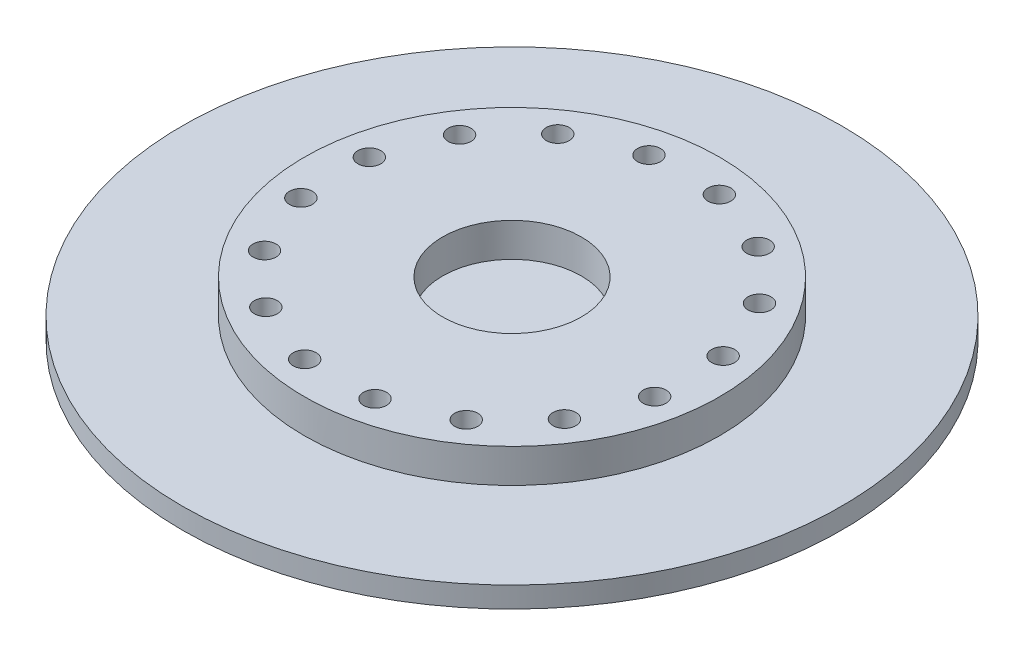
ISO-10303-21;
HEADER;
FILE_DESCRIPTION(('STEP AP214'),'2;1');
FILE_NAME('part.step','',(''),(''),'','','');
FILE_SCHEMA(('AUTOMOTIVE_DESIGN { 1 0 10303 214 1 1 1 1 }'));
ENDSEC;
DATA;
#1=APPLICATION_CONTEXT('core data for automotive mechanical design processes');
#2=APPLICATION_PROTOCOL_DEFINITION('international standard','automotive_design',2000,#1);
#3=PRODUCT_CONTEXT('',#1,'mechanical');
#4=PRODUCT('Part','Part','',(#3));
#5=PRODUCT_RELATED_PRODUCT_CATEGORY('part','',(#4));
#6=PRODUCT_DEFINITION_FORMATION('','',#4);
#7=PRODUCT_DEFINITION_CONTEXT('part definition',#1,'design');
#8=PRODUCT_DEFINITION('design','',#6,#7);
#9=PRODUCT_DEFINITION_SHAPE('','',#8);
#10=(LENGTH_UNIT() NAMED_UNIT(*) SI_UNIT(.MILLI.,.METRE.));
#11=(NAMED_UNIT(*) PLANE_ANGLE_UNIT() SI_UNIT($,.RADIAN.));
#12=(NAMED_UNIT(*) SI_UNIT($,.STERADIAN.) SOLID_ANGLE_UNIT());
#13=UNCERTAINTY_MEASURE_WITH_UNIT(LENGTH_MEASURE(1.E-05),#10,'distance_accuracy_value','');
#14=(GEOMETRIC_REPRESENTATION_CONTEXT(3) GLOBAL_UNCERTAINTY_ASSIGNED_CONTEXT((#13)) GLOBAL_UNIT_ASSIGNED_CONTEXT((#10,
#11,#12)) REPRESENTATION_CONTEXT('',''));
#15=CARTESIAN_POINT('',(0.,0.,0.));
#16=DIRECTION('',(0.,0.,1.));
#17=DIRECTION('',(1.,0.,0.));
#18=AXIS2_PLACEMENT_3D('',#15,#16,#17);
#19=CARTESIAN_POINT('',(0.,7.62,0.));
#20=DIRECTION('',(0.,-1.,0.));
#21=DIRECTION('',(0.,0.,-1.));
#22=AXIS2_PLACEMENT_3D('',#19,#20,#21);
#23=CYLINDRICAL_SURFACE('',#22,120.65);
#24=CARTESIAN_POINT('',(0.,7.62,0.));
#25=DIRECTION('',(0.,1.,0.));
#26=DIRECTION('',(0.,0.,1.));
#27=AXIS2_PLACEMENT_3D('',#24,#25,#26);
#28=CIRCLE('',#27,120.65);
#29=CARTESIAN_POINT('',(0.,7.62,-120.65));
#30=VERTEX_POINT('',#29);
#31=EDGE_CURVE('E39',#30,#30,#28,.T.);
#32=CARTESIAN_POINT('',(0.,0.,0.));
#33=DIRECTION('',(0.,1.,0.));
#34=DIRECTION('',(0.,0.,1.));
#35=AXIS2_PLACEMENT_3D('',#32,#33,#34);
#36=CIRCLE('',#35,120.65);
#37=CARTESIAN_POINT('',(0.,0.,-120.65));
#38=VERTEX_POINT('',#37);
#39=EDGE_CURVE('E34',#38,#38,#36,.T.);
#40=CARTESIAN_POINT('',(0.,7.62,-120.65));
#41=CARTESIAN_POINT('',(0.,7.540625,-120.65));
#42=CARTESIAN_POINT('',(0.,7.46125,-120.65));
#43=CARTESIAN_POINT('',(0.,7.3025,-120.65));
#44=CARTESIAN_POINT('',(0.,7.223125,-120.65));
#45=CARTESIAN_POINT('',(0.,7.064375,-120.65));
#46=CARTESIAN_POINT('',(0.,6.985,-120.65));
#47=CARTESIAN_POINT('',(0.,6.82625,-120.65));
#48=CARTESIAN_POINT('',(0.,6.746875,-120.65));
#49=CARTESIAN_POINT('',(0.,6.588125,-120.65));
#50=CARTESIAN_POINT('',(0.,6.50875,-120.65));
#51=CARTESIAN_POINT('',(0.,6.35,-120.65));
#52=CARTESIAN_POINT('',(0.,6.270625,-120.65));
#53=CARTESIAN_POINT('',(0.,6.111875,-120.65));
#54=CARTESIAN_POINT('',(0.,6.0325,-120.65));
#55=CARTESIAN_POINT('',(0.,5.87375,-120.65));
#56=CARTESIAN_POINT('',(0.,5.794375,-120.65));
#57=CARTESIAN_POINT('',(0.,5.635625,-120.65));
#58=CARTESIAN_POINT('',(0.,5.55625,-120.65));
#59=CARTESIAN_POINT('',(0.,5.3975,-120.65));
#60=CARTESIAN_POINT('',(0.,5.318125,-120.65));
#61=CARTESIAN_POINT('',(0.,5.159375,-120.65));
#62=CARTESIAN_POINT('',(0.,5.08,-120.65));
#63=CARTESIAN_POINT('',(0.,4.92125,-120.65));
#64=CARTESIAN_POINT('',(0.,4.841875,-120.65));
#65=CARTESIAN_POINT('',(0.,4.683125,-120.65));
#66=CARTESIAN_POINT('',(0.,4.60375,-120.65));
#67=CARTESIAN_POINT('',(0.,4.445,-120.65));
#68=CARTESIAN_POINT('',(0.,4.365625,-120.65));
#69=CARTESIAN_POINT('',(0.,4.206875,-120.65));
#70=CARTESIAN_POINT('',(0.,4.1275,-120.65));
#71=CARTESIAN_POINT('',(0.,3.96875,-120.65));
#72=CARTESIAN_POINT('',(0.,3.889375,-120.65));
#73=CARTESIAN_POINT('',(0.,3.730625,-120.65));
#74=CARTESIAN_POINT('',(0.,3.65125,-120.65));
#75=CARTESIAN_POINT('',(0.,3.4925,-120.65));
#76=CARTESIAN_POINT('',(0.,3.413125,-120.65));
#77=CARTESIAN_POINT('',(0.,3.254375,-120.65));
#78=CARTESIAN_POINT('',(0.,3.175,-120.65));
#79=CARTESIAN_POINT('',(0.,3.01625,-120.65));
#80=CARTESIAN_POINT('',(0.,2.936875,-120.65));
#81=CARTESIAN_POINT('',(0.,2.778125,-120.65));
#82=CARTESIAN_POINT('',(0.,2.69875,-120.65));
#83=CARTESIAN_POINT('',(0.,2.54,-120.65));
#84=CARTESIAN_POINT('',(0.,2.460625,-120.65));
#85=CARTESIAN_POINT('',(0.,2.301875,-120.65));
#86=CARTESIAN_POINT('',(0.,2.2225,-120.65));
#87=CARTESIAN_POINT('',(0.,2.06375,-120.65));
#88=CARTESIAN_POINT('',(0.,1.984375,-120.65));
#89=CARTESIAN_POINT('',(0.,1.825625,-120.65));
#90=CARTESIAN_POINT('',(0.,1.74625,-120.65));
#91=CARTESIAN_POINT('',(0.,1.5875,-120.65));
#92=CARTESIAN_POINT('',(0.,1.508125,-120.65));
#93=CARTESIAN_POINT('',(0.,1.349375,-120.65));
#94=CARTESIAN_POINT('',(0.,1.27,-120.65));
#95=CARTESIAN_POINT('',(0.,1.11125,-120.65));
#96=CARTESIAN_POINT('',(0.,1.031875,-120.65));
#97=CARTESIAN_POINT('',(0.,0.873125,-120.65));
#98=CARTESIAN_POINT('',(0.,0.79375,-120.65));
#99=CARTESIAN_POINT('',(0.,0.635,-120.65));
#100=CARTESIAN_POINT('',(0.,0.555625,-120.65));
#101=CARTESIAN_POINT('',(0.,0.396875,-120.65));
#102=CARTESIAN_POINT('',(0.,0.3175,-120.65));
#103=CARTESIAN_POINT('',(0.,0.15875,-120.65));
#104=CARTESIAN_POINT('',(0.,0.0793749999999999,-120.65));
#105=CARTESIAN_POINT('',(0.,0.,-120.65));
#106=B_SPLINE_CURVE_WITH_KNOTS('',3,(#40,#41,#42,#43,#44,#45,#46,#47,#48,#49,#50,#51,#52,#53,
#54,#55,#56,#57,#58,#59,#60,#61,#62,#63,#64,#65,#66,#67,#68,#69,#70,#71,#72,#73,#74,#75,#76,#77,
#78,#79,#80,#81,#82,#83,#84,#85,#86,#87,#88,#89,#90,#91,#92,#93,#94,#95,#96,#97,#98,#99,#100,
#101,#102,#103,#104,#105),.UNSPECIFIED.,.F.,.F.,(4,2,2,2,2,2,2,2,2,2,2,2,2,2,2,2,2,2,2,2,2,2,2,
2,2,2,2,2,2,2,2,2,4),(0.,0.238125,0.47625,0.714375000000001,0.9525,1.190625,1.42875,1.666875,
1.905,2.143125,2.38125,2.619375,2.8575,3.095625,3.33375,3.571875,3.81,4.048125,4.28625,4.524375,
4.7625,5.000625,5.23875,5.476875,5.715,5.953125,6.19125,6.429375,6.6675,6.905625,7.14375,
7.381875,7.62),.UNSPECIFIED.);
#107=EDGE_CURVE('BSEAM31',#30,#38,#106,.T.);
#108=ORIENTED_EDGE('',*,*,#31,.F.);
#109=ORIENTED_EDGE('',*,*,#39,.T.);
#110=ORIENTED_EDGE('',*,*,#107,.T.);
#111=ORIENTED_EDGE('',*,*,#107,.F.);
#112=EDGE_LOOP('',(#108,#110,#109,#111));
#113=FACE_BOUND('',#112,.T.);
#114=ADVANCED_FACE('F31',(#113),#23,.T.);
#115=CARTESIAN_POINT('',(0.,7.62,0.));
#116=DIRECTION('',(0.,1.,0.));
#117=DIRECTION('',(0.,0.,1.));
#118=AXIS2_PLACEMENT_3D('',#115,#116,#117);
#119=PLANE('',#118);
#120=CARTESIAN_POINT('',(0.,7.62,0.));
#121=DIRECTION('',(0.,1.,0.));
#122=DIRECTION('',(0.,0.,1.));
#123=AXIS2_PLACEMENT_3D('',#120,#121,#122);
#124=CIRCLE('',#123,76.0000004);
#125=CARTESIAN_POINT('',(0.,7.62,76.0000004));
#126=VERTEX_POINT('',#125);
#127=EDGE_CURVE('E11',#126,#126,#124,.T.);
#128=ORIENTED_EDGE('',*,*,#127,.F.);
#129=EDGE_LOOP('',(#128));
#130=FACE_BOUND('',#129,.T.);
#131=ORIENTED_EDGE('',*,*,#31,.T.);
#132=EDGE_LOOP('',(#131));
#133=FACE_BOUND('',#132,.T.);
#134=ADVANCED_FACE('F130',(#130,#133),#119,.T.);
#135=CARTESIAN_POINT('',(0.,0.,0.));
#136=DIRECTION('',(0.,1.,0.));
#137=DIRECTION('',(0.,0.,1.));
#138=AXIS2_PLACEMENT_3D('',#135,#136,#137);
#139=PLANE('',#138);
#140=CARTESIAN_POINT('',(13.5729496041598,0.,63.7204640523195));
#141=DIRECTION('',(0.,-1.,0.));
#142=DIRECTION('',(-0.382683432365077,0.,-0.923879532511292));
#143=AXIS2_PLACEMENT_3D('',#140,#141,#142);
#144=CIRCLE('',#143,4.2);
#145=CARTESIAN_POINT('',(11.9656791882264,0.,59.8401700157721));
#146=VERTEX_POINT('',#145);
#147=EDGE_CURVE('E397',#146,#146,#144,.T.);
#148=ORIENTED_EDGE('',*,*,#147,.F.);
#149=EDGE_LOOP('',(#148));
#150=FACE_BOUND('',#149,.T.);
#151=CARTESIAN_POINT('',(36.9245362305284,0.,53.6758895982209));
#152=DIRECTION('',(0.,-1.,0.));
#153=DIRECTION('',(-0.707106781186539,0.,-0.707106781186556));
#154=AXIS2_PLACEMENT_3D('',#151,#152,#153);
#155=CIRCLE('',#154,4.2);
#156=CARTESIAN_POINT('',(33.9546877495449,0.,50.7060411172373));
#157=VERTEX_POINT('',#156);
#158=EDGE_CURVE('E401',#157,#157,#155,.T.);
#159=ORIENTED_EDGE('',*,*,#158,.F.);
#160=EDGE_LOOP('',(#159));
#161=FACE_BOUND('',#160,.T.);
#162=CARTESIAN_POINT('',(54.6546969375535,0.,35.459647525944));
#163=DIRECTION('',(0.,-1.,0.));
#164=DIRECTION('',(-0.923879532511283,0.,-0.3826834323651));
#165=AXIS2_PLACEMENT_3D('',#162,#163,#164);
#166=CIRCLE('',#165,4.2);
#167=CARTESIAN_POINT('',(50.7744029010061,0.,33.8523771100105));
#168=VERTEX_POINT('',#167);
#169=EDGE_CURVE('E410',#168,#168,#166,.T.);
#170=ORIENTED_EDGE('',*,*,#169,.F.);
#171=EDGE_LOOP('',(#170));
#172=FACE_BOUND('',#171,.T.);
#173=CARTESIAN_POINT('',(64.0641754818975,0.,11.8449955603474));
#174=DIRECTION('',(0.,-1.,0.));
#175=DIRECTION('',(-1.,0.,0.));
#176=AXIS2_PLACEMENT_3D('',#173,#174,#175);
#177=CIRCLE('',#176,4.2);
#178=CARTESIAN_POINT('',(59.8641754818975,0.,11.8449955603473));
#179=VERTEX_POINT('',#178);
#180=EDGE_CURVE('E416',#179,#179,#177,.T.);
#181=ORIENTED_EDGE('',*,*,#180,.F.);
#182=EDGE_LOOP('',(#181));
#183=FACE_BOUND('',#182,.T.);
#184=CARTESIAN_POINT('',(63.7204640523194,0.,-13.57294960416));
#185=DIRECTION('',(0.,-1.,0.));
#186=DIRECTION('',(-0.923879532511291,0.,0.382683432365081));
#187=AXIS2_PLACEMENT_3D('',#184,#185,#186);
#188=CIRCLE('',#187,4.2);
#189=CARTESIAN_POINT('',(59.840170015772,0.,-11.9656791882266));
#190=VERTEX_POINT('',#189);
#191=EDGE_CURVE('E422',#190,#190,#188,.T.);
#192=ORIENTED_EDGE('',*,*,#191,.F.);
#193=EDGE_LOOP('',(#192));
#194=FACE_BOUND('',#193,.T.);
#195=CARTESIAN_POINT('',(53.6758895982208,0.,-36.9245362305286));
#196=DIRECTION('',(0.,-1.,0.));
#197=DIRECTION('',(-0.707106781186554,0.,0.707106781186541));
#198=AXIS2_PLACEMENT_3D('',#195,#196,#197);
#199=CIRCLE('',#198,4.2);
#200=CARTESIAN_POINT('',(50.7060411172372,0.,-33.9546877495451));
#201=VERTEX_POINT('',#200);
#202=EDGE_CURVE('E428',#201,#201,#199,.T.);
#203=ORIENTED_EDGE('',*,*,#202,.F.);
#204=EDGE_LOOP('',(#203));
#205=FACE_BOUND('',#204,.T.);
#206=CARTESIAN_POINT('',(35.4596475259438,0.,-54.6546969375536));
#207=DIRECTION('',(0.,-1.,0.));
#208=DIRECTION('',(-0.382683432365097,0.,0.923879532511284));
#209=AXIS2_PLACEMENT_3D('',#206,#207,#208);
#210=CIRCLE('',#209,4.2);
#211=CARTESIAN_POINT('',(33.8523771100104,0.,-50.7744029010062));
#212=VERTEX_POINT('',#211);
#213=EDGE_CURVE('E434',#212,#212,#210,.T.);
#214=ORIENTED_EDGE('',*,*,#213,.F.);
#215=EDGE_LOOP('',(#214));
#216=FACE_BOUND('',#215,.T.);
#217=CARTESIAN_POINT('',(11.8449955603471,0.,-64.0641754818975));
#218=DIRECTION('',(0.,-1.,0.));
#219=DIRECTION('',(0.,0.,1.));
#220=AXIS2_PLACEMENT_3D('',#217,#218,#219);
#221=CIRCLE('',#220,4.2);
#222=CARTESIAN_POINT('',(11.8449955603471,0.,-59.8641754818975));
#223=VERTEX_POINT('',#222);
#224=EDGE_CURVE('E440',#223,#223,#221,.T.);
#225=ORIENTED_EDGE('',*,*,#224,.F.);
#226=EDGE_LOOP('',(#225));
#227=FACE_BOUND('',#226,.T.);
#228=CARTESIAN_POINT('',(-13.5729496041602,0.,-63.7204640523194));
#229=DIRECTION('',(0.,-1.,0.));
#230=DIRECTION('',(0.382683432365084,0.,0.923879532511289));
#231=AXIS2_PLACEMENT_3D('',#228,#229,#230);
#232=CIRCLE('',#231,4.2);
#233=CARTESIAN_POINT('',(-11.9656791882269,0.,-59.840170015772));
#234=VERTEX_POINT('',#233);
#235=EDGE_CURVE('E446',#234,#234,#232,.T.);
#236=ORIENTED_EDGE('',*,*,#235,.F.);
#237=EDGE_LOOP('',(#236));
#238=FACE_BOUND('',#237,.T.);
#239=CARTESIAN_POINT('',(-36.9245362305288,0.,-53.6758895982206));
#240=DIRECTION('',(0.,-1.,0.));
#241=DIRECTION('',(0.707106781186544,0.,0.707106781186551));
#242=AXIS2_PLACEMENT_3D('',#239,#240,#241);
#243=CIRCLE('',#242,4.2);
#244=CARTESIAN_POINT('',(-33.9546877495453,0.,-50.7060411172371));
#245=VERTEX_POINT('',#244);
#246=EDGE_CURVE('E452',#245,#245,#243,.T.);
#247=ORIENTED_EDGE('',*,*,#246,.F.);
#248=EDGE_LOOP('',(#247));
#249=FACE_BOUND('',#248,.T.);
#250=CARTESIAN_POINT('',(-54.6546969375537,0.,-35.4596475259436));
#251=DIRECTION('',(0.,-1.,0.));
#252=DIRECTION('',(0.923879532511285,0.,0.382683432365094));
#253=AXIS2_PLACEMENT_3D('',#250,#251,#252);
#254=CIRCLE('',#253,4.2);
#255=CARTESIAN_POINT('',(-50.7744029010063,0.,-33.8523771100102));
#256=VERTEX_POINT('',#255);
#257=EDGE_CURVE('E458',#256,#256,#254,.T.);
#258=ORIENTED_EDGE('',*,*,#257,.F.);
#259=EDGE_LOOP('',(#258));
#260=FACE_BOUND('',#259,.T.);
#261=CARTESIAN_POINT('',(-64.0641754818975,0.,-11.8449955603469));
#262=DIRECTION('',(0.,-1.,0.));
#263=DIRECTION('',(1.,0.,0.));
#264=AXIS2_PLACEMENT_3D('',#261,#262,#263);
#265=CIRCLE('',#264,4.2);
#266=CARTESIAN_POINT('',(-59.8641754818975,0.,-11.8449955603469));
#267=VERTEX_POINT('',#266);
#268=EDGE_CURVE('E464',#267,#267,#265,.T.);
#269=ORIENTED_EDGE('',*,*,#268,.F.);
#270=EDGE_LOOP('',(#269));
#271=FACE_BOUND('',#270,.T.);
#272=CARTESIAN_POINT('',(-63.7204640523193,0.,13.5729496041605));
#273=DIRECTION('',(0.,-1.,0.));
#274=DIRECTION('',(0.923879532511288,0.,-0.382683432365087));
#275=AXIS2_PLACEMENT_3D('',#272,#273,#274);
#276=CIRCLE('',#275,4.2);
#277=CARTESIAN_POINT('',(-59.8401700157719,0.,11.9656791882271));
#278=VERTEX_POINT('',#277);
#279=EDGE_CURVE('E470',#278,#278,#276,.T.);
#280=ORIENTED_EDGE('',*,*,#279,.F.);
#281=EDGE_LOOP('',(#280));
#282=FACE_BOUND('',#281,.T.);
#283=CARTESIAN_POINT('',(-53.6758895982205,0.,36.9245362305289));
#284=DIRECTION('',(0.,-1.,0.));
#285=DIRECTION('',(0.707106781186549,0.,-0.707106781186546));
#286=AXIS2_PLACEMENT_3D('',#283,#284,#285);
#287=CIRCLE('',#286,4.2);
#288=CARTESIAN_POINT('',(-50.706041117237,0.,33.9546877495454));
#289=VERTEX_POINT('',#288);
#290=EDGE_CURVE('E476',#289,#289,#287,.T.);
#291=ORIENTED_EDGE('',*,*,#290,.F.);
#292=EDGE_LOOP('',(#291));
#293=FACE_BOUND('',#292,.T.);
#294=CARTESIAN_POINT('',(-35.4596475259434,0.,54.6546969375538));
#295=DIRECTION('',(0.,-1.,0.));
#296=DIRECTION('',(0.382683432365091,0.,-0.923879532511287));
#297=AXIS2_PLACEMENT_3D('',#294,#295,#296);
#298=CIRCLE('',#297,4.2);
#299=CARTESIAN_POINT('',(-33.85237711001,0.,50.7744029010064));
#300=VERTEX_POINT('',#299);
#301=EDGE_CURVE('E482',#300,#300,#298,.T.);
#302=ORIENTED_EDGE('',*,*,#301,.F.);
#303=EDGE_LOOP('',(#302));
#304=FACE_BOUND('',#303,.T.);
#305=CARTESIAN_POINT('',(-11.8449955603467,0.,64.0641754818976));
#306=DIRECTION('',(0.,-1.,0.));
#307=DIRECTION('',(0.,0.,-1.));
#308=AXIS2_PLACEMENT_3D('',#305,#306,#307);
#309=CIRCLE('',#308,4.2);
#310=CARTESIAN_POINT('',(-11.8449955603467,0.,59.8641754818976));
#311=VERTEX_POINT('',#310);
#312=EDGE_CURVE('E488',#311,#311,#309,.T.);
#313=ORIENTED_EDGE('',*,*,#312,.F.);
#314=EDGE_LOOP('',(#313));
#315=FACE_BOUND('',#314,.T.);
#316=DIRECTION('',(0.928969398552066,0.,0.370156529800316));
#317=VECTOR('',#316,1.);
#318=CARTESIAN_POINT('',(28.8692658729767,0.,-70.30786291602));
#319=LINE('',#318,#317);
#320=CARTESIAN_POINT('',(27.3945269527971,0.,-70.8954864070693));
#321=VERTEX_POINT('',#320);
#322=CARTESIAN_POINT('',(28.8692658729767,0.,-70.30786291602));
#323=VERTEX_POINT('',#322);
#324=EDGE_CURVE('E82',#321,#323,#319,.T.);
#325=ORIENTED_EDGE('',*,*,#324,.F.);
#326=DIRECTION('',(0.37015652980032,0.,-0.928969398552065));
#327=VECTOR('',#326,1.);
#328=CARTESIAN_POINT('',(-28.8692658729766,0.,70.30786291602));
#329=LINE('',#328,#327);
#330=CARTESIAN_POINT('',(-28.8692658729766,0.,70.30786291602));
#331=VERTEX_POINT('',#330);
#332=EDGE_CURVE('E47',#331,#321,#329,.T.);
#333=ORIENTED_EDGE('',*,*,#332,.F.);
#334=DIRECTION('',(-0.928969398552065,0.,-0.37015652980032));
#335=VECTOR('',#334,1.);
#336=CARTESIAN_POINT('',(-27.3945269527971,0.,70.8954864070693));
#337=LINE('',#336,#335);
#338=CARTESIAN_POINT('',(-27.3945269527971,0.,70.8954864070693));
#339=VERTEX_POINT('',#338);
#340=EDGE_CURVE('E98',#339,#331,#337,.T.);
#341=ORIENTED_EDGE('',*,*,#340,.F.);
#342=DIRECTION('',(-0.37015652980032,0.,0.928969398552065));
#343=VECTOR('',#342,1.);
#344=CARTESIAN_POINT('',(-27.3945269527971,0.,70.8954864070693));
#345=LINE('',#344,#343);
#346=EDGE_CURVE('E106',#323,#339,#345,.T.);
#347=ORIENTED_EDGE('',*,*,#346,.F.);
#348=EDGE_LOOP('',(#325,#333,#341,#347));
#349=FACE_BOUND('',#348,.T.);
#350=ORIENTED_EDGE('',*,*,#39,.F.);
#351=EDGE_LOOP('',(#350));
#352=FACE_BOUND('',#351,.T.);
#353=ADVANCED_FACE('F127',(#150,#161,#172,#183,#194,#205,#216,#227,#238,#249,#260,#271,#282,
#293,#304,#315,#349,#352),#139,.F.);
#354=CARTESIAN_POINT('',(0.,20.,0.));
#355=DIRECTION('',(0.,-1.,0.));
#356=DIRECTION('',(0.,0.,-1.));
#357=AXIS2_PLACEMENT_3D('',#354,#355,#356);
#358=CYLINDRICAL_SURFACE('',#357,76.0000004);
#359=ORIENTED_EDGE('',*,*,#127,.T.);
#360=EDGE_LOOP('',(#359));
#361=FACE_BOUND('',#360,.T.);
#362=CARTESIAN_POINT('',(0.,20.,0.));
#363=DIRECTION('',(0.,-1.,0.));
#364=DIRECTION('',(0.,0.,-1.));
#365=AXIS2_PLACEMENT_3D('',#362,#363,#364);
#366=CIRCLE('',#365,76.0000004);
#367=CARTESIAN_POINT('',(0.,20.,-76.0000004));
#368=VERTEX_POINT('',#367);
#369=EDGE_CURVE('E115',#368,#368,#366,.T.);
#370=ORIENTED_EDGE('',*,*,#369,.T.);
#371=EDGE_LOOP('',(#370));
#372=FACE_BOUND('',#371,.T.);
#373=ADVANCED_FACE('F129',(#361,#372),#358,.T.);
#374=CARTESIAN_POINT('',(0.,20.,0.));
#375=DIRECTION('',(0.,-1.,0.));
#376=DIRECTION('',(0.,0.,-1.));
#377=AXIS2_PLACEMENT_3D('',#374,#375,#376);
#378=PLANE('',#377);
#379=CARTESIAN_POINT('',(13.5729496041598,20.,63.7204640523195));
#380=DIRECTION('',(0.,-1.,0.));
#381=DIRECTION('',(0.,0.,-1.));
#382=AXIS2_PLACEMENT_3D('',#379,#380,#381);
#383=CIRCLE('',#382,4.2);
#384=CARTESIAN_POINT('',(13.5729496041598,20.,59.5204640523195));
#385=VERTEX_POINT('',#384);
#386=EDGE_CURVE('E400',#385,#385,#383,.F.);
#387=ORIENTED_EDGE('',*,*,#386,.F.);
#388=EDGE_LOOP('',(#387));
#389=FACE_BOUND('',#388,.T.);
#390=CARTESIAN_POINT('',(36.9245362305284,20.,53.6758895982209));
#391=DIRECTION('',(0.,-1.,0.));
#392=DIRECTION('',(0.,0.,-1.));
#393=AXIS2_PLACEMENT_3D('',#390,#391,#392);
#394=CIRCLE('',#393,4.2);
#395=CARTESIAN_POINT('',(36.9245362305284,20.,49.4758895982209));
#396=VERTEX_POINT('',#395);
#397=EDGE_CURVE('E404',#396,#396,#394,.F.);
#398=ORIENTED_EDGE('',*,*,#397,.F.);
#399=EDGE_LOOP('',(#398));
#400=FACE_BOUND('',#399,.T.);
#401=CARTESIAN_POINT('',(54.6546969375535,20.,35.459647525944));
#402=DIRECTION('',(0.,-1.,0.));
#403=DIRECTION('',(0.,0.,-1.));
#404=AXIS2_PLACEMENT_3D('',#401,#402,#403);
#405=CIRCLE('',#404,4.2);
#406=CARTESIAN_POINT('',(54.6546969375535,20.,31.259647525944));
#407=VERTEX_POINT('',#406);
#408=EDGE_CURVE('E413',#407,#407,#405,.F.);
#409=ORIENTED_EDGE('',*,*,#408,.F.);
#410=EDGE_LOOP('',(#409));
#411=FACE_BOUND('',#410,.T.);
#412=CARTESIAN_POINT('',(64.0641754818975,20.,11.8449955603474));
#413=DIRECTION('',(0.,-1.,0.));
#414=DIRECTION('',(0.,0.,-1.));
#415=AXIS2_PLACEMENT_3D('',#412,#413,#414);
#416=CIRCLE('',#415,4.2);
#417=CARTESIAN_POINT('',(64.0641754818975,20.,7.64499556034737));
#418=VERTEX_POINT('',#417);
#419=EDGE_CURVE('E419',#418,#418,#416,.F.);
#420=ORIENTED_EDGE('',*,*,#419,.F.);
#421=EDGE_LOOP('',(#420));
#422=FACE_BOUND('',#421,.T.);
#423=CARTESIAN_POINT('',(63.7204640523194,20.,-13.57294960416));
#424=DIRECTION('',(0.,-1.,0.));
#425=DIRECTION('',(0.,0.,-1.));
#426=AXIS2_PLACEMENT_3D('',#423,#424,#425);
#427=CIRCLE('',#426,4.2);
#428=CARTESIAN_POINT('',(63.7204640523194,20.,-17.77294960416));
#429=VERTEX_POINT('',#428);
#430=EDGE_CURVE('E425',#429,#429,#427,.F.);
#431=ORIENTED_EDGE('',*,*,#430,.F.);
#432=EDGE_LOOP('',(#431));
#433=FACE_BOUND('',#432,.T.);
#434=CARTESIAN_POINT('',(53.6758895982208,20.,-36.9245362305286));
#435=DIRECTION('',(0.,-1.,0.));
#436=DIRECTION('',(0.,0.,-1.));
#437=AXIS2_PLACEMENT_3D('',#434,#435,#436);
#438=CIRCLE('',#437,4.2);
#439=CARTESIAN_POINT('',(53.6758895982208,20.,-41.1245362305286));
#440=VERTEX_POINT('',#439);
#441=EDGE_CURVE('E431',#440,#440,#438,.F.);
#442=ORIENTED_EDGE('',*,*,#441,.F.);
#443=EDGE_LOOP('',(#442));
#444=FACE_BOUND('',#443,.T.);
#445=CARTESIAN_POINT('',(35.4596475259438,20.,-54.6546969375536));
#446=DIRECTION('',(0.,-1.,0.));
#447=DIRECTION('',(0.,0.,-1.));
#448=AXIS2_PLACEMENT_3D('',#445,#446,#447);
#449=CIRCLE('',#448,4.2);
#450=CARTESIAN_POINT('',(35.4596475259438,20.,-58.8546969375536));
#451=VERTEX_POINT('',#450);
#452=EDGE_CURVE('E437',#451,#451,#449,.F.);
#453=ORIENTED_EDGE('',*,*,#452,.F.);
#454=EDGE_LOOP('',(#453));
#455=FACE_BOUND('',#454,.T.);
#456=CARTESIAN_POINT('',(11.8449955603471,20.,-64.0641754818975));
#457=DIRECTION('',(0.,-1.,0.));
#458=DIRECTION('',(0.,0.,-1.));
#459=AXIS2_PLACEMENT_3D('',#456,#457,#458);
#460=CIRCLE('',#459,4.2);
#461=CARTESIAN_POINT('',(11.8449955603471,20.,-68.2641754818975));
#462=VERTEX_POINT('',#461);
#463=EDGE_CURVE('E443',#462,#462,#460,.F.);
#464=ORIENTED_EDGE('',*,*,#463,.F.);
#465=EDGE_LOOP('',(#464));
#466=FACE_BOUND('',#465,.T.);
#467=CARTESIAN_POINT('',(-13.5729496041602,20.,-63.7204640523194));
#468=DIRECTION('',(0.,-1.,0.));
#469=DIRECTION('',(0.,0.,-1.));
#470=AXIS2_PLACEMENT_3D('',#467,#468,#469);
#471=CIRCLE('',#470,4.2);
#472=CARTESIAN_POINT('',(-13.5729496041602,20.,-67.9204640523194));
#473=VERTEX_POINT('',#472);
#474=EDGE_CURVE('E449',#473,#473,#471,.F.);
#475=ORIENTED_EDGE('',*,*,#474,.F.);
#476=EDGE_LOOP('',(#475));
#477=FACE_BOUND('',#476,.T.);
#478=CARTESIAN_POINT('',(-36.9245362305288,20.,-53.6758895982206));
#479=DIRECTION('',(0.,-1.,0.));
#480=DIRECTION('',(0.,0.,-1.));
#481=AXIS2_PLACEMENT_3D('',#478,#479,#480);
#482=CIRCLE('',#481,4.2);
#483=CARTESIAN_POINT('',(-36.9245362305288,20.,-57.8758895982206));
#484=VERTEX_POINT('',#483);
#485=EDGE_CURVE('E455',#484,#484,#482,.F.);
#486=ORIENTED_EDGE('',*,*,#485,.F.);
#487=EDGE_LOOP('',(#486));
#488=FACE_BOUND('',#487,.T.);
#489=CARTESIAN_POINT('',(-54.6546969375537,20.,-35.4596475259436));
#490=DIRECTION('',(0.,-1.,0.));
#491=DIRECTION('',(0.,0.,-1.));
#492=AXIS2_PLACEMENT_3D('',#489,#490,#491);
#493=CIRCLE('',#492,4.2);
#494=CARTESIAN_POINT('',(-54.6546969375537,20.,-39.6596475259436));
#495=VERTEX_POINT('',#494);
#496=EDGE_CURVE('E461',#495,#495,#493,.F.);
#497=ORIENTED_EDGE('',*,*,#496,.F.);
#498=EDGE_LOOP('',(#497));
#499=FACE_BOUND('',#498,.T.);
#500=CARTESIAN_POINT('',(-64.0641754818975,20.,-11.8449955603469));
#501=DIRECTION('',(0.,-1.,0.));
#502=DIRECTION('',(0.,0.,-1.));
#503=AXIS2_PLACEMENT_3D('',#500,#501,#502);
#504=CIRCLE('',#503,4.2);
#505=CARTESIAN_POINT('',(-64.0641754818975,20.,-16.0449955603469));
#506=VERTEX_POINT('',#505);
#507=EDGE_CURVE('E467',#506,#506,#504,.F.);
#508=ORIENTED_EDGE('',*,*,#507,.F.);
#509=EDGE_LOOP('',(#508));
#510=FACE_BOUND('',#509,.T.);
#511=CARTESIAN_POINT('',(-63.7204640523193,20.,13.5729496041605));
#512=DIRECTION('',(0.,-1.,0.));
#513=DIRECTION('',(0.,0.,-1.));
#514=AXIS2_PLACEMENT_3D('',#511,#512,#513);
#515=CIRCLE('',#514,4.2);
#516=CARTESIAN_POINT('',(-63.7204640523193,20.,9.37294960416046));
#517=VERTEX_POINT('',#516);
#518=EDGE_CURVE('E473',#517,#517,#515,.F.);
#519=ORIENTED_EDGE('',*,*,#518,.F.);
#520=EDGE_LOOP('',(#519));
#521=FACE_BOUND('',#520,.T.);
#522=CARTESIAN_POINT('',(-53.6758895982205,20.,36.9245362305289));
#523=DIRECTION('',(0.,-1.,0.));
#524=DIRECTION('',(0.,0.,-1.));
#525=AXIS2_PLACEMENT_3D('',#522,#523,#524);
#526=CIRCLE('',#525,4.2);
#527=CARTESIAN_POINT('',(-53.6758895982205,20.,32.7245362305289));
#528=VERTEX_POINT('',#527);
#529=EDGE_CURVE('E479',#528,#528,#526,.F.);
#530=ORIENTED_EDGE('',*,*,#529,.F.);
#531=EDGE_LOOP('',(#530));
#532=FACE_BOUND('',#531,.T.);
#533=CARTESIAN_POINT('',(-35.4596475259434,20.,54.6546969375538));
#534=DIRECTION('',(0.,-1.,0.));
#535=DIRECTION('',(0.,0.,-1.));
#536=AXIS2_PLACEMENT_3D('',#533,#534,#535);
#537=CIRCLE('',#536,4.2);
#538=CARTESIAN_POINT('',(-35.4596475259434,20.,50.4546969375538));
#539=VERTEX_POINT('',#538);
#540=EDGE_CURVE('E485',#539,#539,#537,.F.);
#541=ORIENTED_EDGE('',*,*,#540,.F.);
#542=EDGE_LOOP('',(#541));
#543=FACE_BOUND('',#542,.T.);
#544=CARTESIAN_POINT('',(-11.8449955603467,20.,64.0641754818976));
#545=DIRECTION('',(0.,-1.,0.));
#546=DIRECTION('',(0.,0.,-1.));
#547=AXIS2_PLACEMENT_3D('',#544,#545,#546);
#548=CIRCLE('',#547,4.2);
#549=CARTESIAN_POINT('',(-11.8449955603467,20.,59.8641754818976));
#550=VERTEX_POINT('',#549);
#551=EDGE_CURVE('E104',#550,#550,#548,.F.);
#552=ORIENTED_EDGE('',*,*,#551,.F.);
#553=EDGE_LOOP('',(#552));
#554=FACE_BOUND('',#553,.T.);
#555=CARTESIAN_POINT('',(0.,20.,0.));
#556=DIRECTION('',(0.,-1.,0.));
#557=DIRECTION('',(0.,0.,-1.));
#558=AXIS2_PLACEMENT_3D('',#555,#556,#557);
#559=CIRCLE('',#558,25.4);
#560=CARTESIAN_POINT('',(0.,20.,-25.4));
#561=VERTEX_POINT('',#560);
#562=EDGE_CURVE('E110',#561,#561,#559,.T.);
#563=ORIENTED_EDGE('',*,*,#562,.T.);
#564=EDGE_LOOP('',(#563));
#565=FACE_BOUND('',#564,.T.);
#566=ORIENTED_EDGE('',*,*,#369,.F.);
#567=EDGE_LOOP('',(#566));
#568=FACE_BOUND('',#567,.T.);
#569=ADVANCED_FACE('F136',(#389,#400,#411,#422,#433,#444,#455,#466,#477,#488,#499,#510,#521,
#532,#543,#554,#565,#568),#378,.F.);
#570=CARTESIAN_POINT('',(0.,20.,0.));
#571=DIRECTION('',(0.,-1.,0.));
#572=DIRECTION('',(0.,0.,-1.));
#573=AXIS2_PLACEMENT_3D('',#570,#571,#572);
#574=CYLINDRICAL_SURFACE('',#573,25.4);
#575=CARTESIAN_POINT('',(0.,7.62,0.));
#576=DIRECTION('',(0.,1.,0.));
#577=DIRECTION('',(0.,0.,1.));
#578=AXIS2_PLACEMENT_3D('',#575,#576,#577);
#579=CIRCLE('',#578,25.4);
#580=CARTESIAN_POINT('',(0.,7.62,25.4));
#581=VERTEX_POINT('',#580);
#582=EDGE_CURVE('E118',#581,#581,#579,.T.);
#583=ORIENTED_EDGE('',*,*,#582,.F.);
#584=EDGE_LOOP('',(#583));
#585=FACE_BOUND('',#584,.T.);
#586=ORIENTED_EDGE('',*,*,#562,.F.);
#587=EDGE_LOOP('',(#586));
#588=FACE_BOUND('',#587,.T.);
#589=ADVANCED_FACE('F167',(#585,#588),#574,.F.);
#590=ORIENTED_EDGE('',*,*,#582,.T.);
#591=EDGE_LOOP('',(#590));
#592=FACE_BOUND('',#591,.T.);
#593=ADVANCED_FACE('F141',(#592),#119,.T.);
#594=CARTESIAN_POINT('',(-28.8692658729766,1.016,70.30786291602));
#595=DIRECTION('',(-0.928969398552065,0.,-0.37015652980032));
#596=DIRECTION('',(-0.37015652980032,0.,0.928969398552065));
#597=AXIS2_PLACEMENT_3D('',#594,#595,#596);
#598=PLANE('',#597);
#599=ORIENTED_EDGE('',*,*,#332,.T.);
#600=DIRECTION('',(0.,-1.,0.));
#601=VECTOR('',#600,1.);
#602=CARTESIAN_POINT('',(27.3945269527971,1.016,-70.8954864070693));
#603=LINE('',#602,#601);
#604=CARTESIAN_POINT('',(27.3945269527971,1.016,-70.8954864070693));
#605=VERTEX_POINT('',#604);
#606=EDGE_CURVE('E70',#605,#321,#603,.T.);
#607=ORIENTED_EDGE('',*,*,#606,.F.);
#608=DIRECTION('',(0.37015652980032,0.,-0.928969398552065));
#609=VECTOR('',#608,1.);
#610=CARTESIAN_POINT('',(-28.8692658729766,1.016,70.30786291602));
#611=LINE('',#610,#609);
#612=CARTESIAN_POINT('',(-28.8692658729766,1.016,70.30786291602));
#613=VERTEX_POINT('',#612);
#614=EDGE_CURVE('E96',#613,#605,#611,.T.);
#615=ORIENTED_EDGE('',*,*,#614,.F.);
#616=DIRECTION('',(0.,-1.,0.));
#617=VECTOR('',#616,1.);
#618=CARTESIAN_POINT('',(-28.8692658729766,1.016,70.30786291602));
#619=LINE('',#618,#617);
#620=EDGE_CURVE('E55',#613,#331,#619,.T.);
#621=ORIENTED_EDGE('',*,*,#620,.T.);
#622=EDGE_LOOP('',(#599,#607,#615,#621));
#623=FACE_BOUND('',#622,.T.);
#624=ADVANCED_FACE('F181',(#623),#598,.F.);
#625=CARTESIAN_POINT('',(-27.3945269527971,1.016,70.8954864070693));
#626=DIRECTION('',(-0.37015652980032,0.,0.928969398552065));
#627=DIRECTION('',(0.928969398552065,0.,0.37015652980032));
#628=AXIS2_PLACEMENT_3D('',#625,#626,#627);
#629=PLANE('',#628);
#630=ORIENTED_EDGE('',*,*,#340,.T.);
#631=ORIENTED_EDGE('',*,*,#620,.F.);
#632=DIRECTION('',(-0.928969398552065,0.,-0.37015652980032));
#633=VECTOR('',#632,1.);
#634=CARTESIAN_POINT('',(-27.3945269527971,1.016,70.8954864070693));
#635=LINE('',#634,#633);
#636=CARTESIAN_POINT('',(-27.3945269527971,1.016,70.8954864070693));
#637=VERTEX_POINT('',#636);
#638=EDGE_CURVE('E93',#637,#613,#635,.T.);
#639=ORIENTED_EDGE('',*,*,#638,.F.);
#640=DIRECTION('',(0.,-1.,0.));
#641=VECTOR('',#640,1.);
#642=CARTESIAN_POINT('',(-27.3945269527971,1.016,70.8954864070693));
#643=LINE('',#642,#641);
#644=EDGE_CURVE('E86',#637,#339,#643,.T.);
#645=ORIENTED_EDGE('',*,*,#644,.T.);
#646=EDGE_LOOP('',(#630,#631,#639,#645));
#647=FACE_BOUND('',#646,.T.);
#648=ADVANCED_FACE('F189',(#647),#629,.F.);
#649=CARTESIAN_POINT('',(-27.3945269527971,1.016,70.8954864070693));
#650=DIRECTION('',(0.928969398552065,0.,0.37015652980032));
#651=DIRECTION('',(0.37015652980032,0.,-0.928969398552065));
#652=AXIS2_PLACEMENT_3D('',#649,#650,#651);
#653=PLANE('',#652);
#654=ORIENTED_EDGE('',*,*,#346,.T.);
#655=ORIENTED_EDGE('',*,*,#644,.F.);
#656=DIRECTION('',(-0.37015652980032,0.,0.928969398552065));
#657=VECTOR('',#656,1.);
#658=CARTESIAN_POINT('',(-27.3945269527971,1.016,70.8954864070693));
#659=LINE('',#658,#657);
#660=CARTESIAN_POINT('',(28.8692658729767,1.016,-70.30786291602));
#661=VERTEX_POINT('',#660);
#662=EDGE_CURVE('E89',#661,#637,#659,.T.);
#663=ORIENTED_EDGE('',*,*,#662,.F.);
#664=DIRECTION('',(0.,-1.,0.));
#665=VECTOR('',#664,1.);
#666=CARTESIAN_POINT('',(28.8692658729767,1.016,-70.30786291602));
#667=LINE('',#666,#665);
#668=EDGE_CURVE('E75',#661,#323,#667,.T.);
#669=ORIENTED_EDGE('',*,*,#668,.T.);
#670=EDGE_LOOP('',(#654,#655,#663,#669));
#671=FACE_BOUND('',#670,.T.);
#672=ADVANCED_FACE('F90',(#671),#653,.F.);
#673=CARTESIAN_POINT('',(28.8692658729767,1.016,-70.30786291602));
#674=DIRECTION('',(0.370156529800316,0.,-0.928969398552066));
#675=DIRECTION('',(-0.928969398552066,0.,-0.370156529800316));
#676=AXIS2_PLACEMENT_3D('',#673,#674,#675);
#677=PLANE('',#676);
#678=ORIENTED_EDGE('',*,*,#324,.T.);
#679=ORIENTED_EDGE('',*,*,#668,.F.);
#680=DIRECTION('',(0.928969398552066,0.,0.370156529800316));
#681=VECTOR('',#680,1.);
#682=CARTESIAN_POINT('',(28.8692658729767,1.016,-70.30786291602));
#683=LINE('',#682,#681);
#684=EDGE_CURVE('E79',#605,#661,#683,.T.);
#685=ORIENTED_EDGE('',*,*,#684,.F.);
#686=ORIENTED_EDGE('',*,*,#606,.T.);
#687=EDGE_LOOP('',(#678,#679,#685,#686));
#688=FACE_BOUND('',#687,.T.);
#689=ADVANCED_FACE('F77',(#688),#677,.F.);
#690=CARTESIAN_POINT('',(27.3945269527971,1.016,-70.8954864070693));
#691=DIRECTION('',(0.,1.,0.));
#692=DIRECTION('',(0.,0.,1.));
#693=AXIS2_PLACEMENT_3D('',#690,#691,#692);
#694=PLANE('',#693);
#695=ORIENTED_EDGE('',*,*,#614,.T.);
#696=ORIENTED_EDGE('',*,*,#684,.T.);
#697=ORIENTED_EDGE('',*,*,#662,.T.);
#698=ORIENTED_EDGE('',*,*,#638,.T.);
#699=EDGE_LOOP('',(#695,#696,#697,#698));
#700=FACE_BOUND('',#699,.T.);
#701=ADVANCED_FACE('F95',(#700),#694,.F.);
#702=CARTESIAN_POINT('',(-11.8449955603467,20.001,64.0641754818976));
#703=DIRECTION('',(0.,-1.,0.));
#704=DIRECTION('',(0.,0.,-1.));
#705=AXIS2_PLACEMENT_3D('',#702,#703,#704);
#706=CYLINDRICAL_SURFACE('',#705,4.2);
#707=ORIENTED_EDGE('',*,*,#312,.T.);
#708=EDGE_LOOP('',(#707));
#709=FACE_BOUND('',#708,.T.);
#710=ORIENTED_EDGE('',*,*,#551,.T.);
#711=EDGE_LOOP('',(#710));
#712=FACE_BOUND('',#711,.T.);
#713=ADVANCED_FACE('F222',(#709,#712),#706,.F.);
#714=CARTESIAN_POINT('',(-35.4596475259434,20.001,54.6546969375538));
#715=DIRECTION('',(0.,-1.,0.));
#716=DIRECTION('',(0.,0.,-1.));
#717=AXIS2_PLACEMENT_3D('',#714,#715,#716);
#718=CYLINDRICAL_SURFACE('',#717,4.2);
#719=ORIENTED_EDGE('',*,*,#301,.T.);
#720=EDGE_LOOP('',(#719));
#721=FACE_BOUND('',#720,.T.);
#722=ORIENTED_EDGE('',*,*,#540,.T.);
#723=EDGE_LOOP('',(#722));
#724=FACE_BOUND('',#723,.T.);
#725=ADVANCED_FACE('F230',(#721,#724),#718,.F.);
#726=CARTESIAN_POINT('',(-53.6758895982205,20.001,36.9245362305289));
#727=DIRECTION('',(0.,-1.,0.));
#728=DIRECTION('',(0.,0.,-1.));
#729=AXIS2_PLACEMENT_3D('',#726,#727,#728);
#730=CYLINDRICAL_SURFACE('',#729,4.2);
#731=ORIENTED_EDGE('',*,*,#290,.T.);
#732=EDGE_LOOP('',(#731));
#733=FACE_BOUND('',#732,.T.);
#734=ORIENTED_EDGE('',*,*,#529,.T.);
#735=EDGE_LOOP('',(#734));
#736=FACE_BOUND('',#735,.T.);
#737=ADVANCED_FACE('F251',(#733,#736),#730,.F.);
#738=CARTESIAN_POINT('',(-63.7204640523193,20.001,13.5729496041605));
#739=DIRECTION('',(0.,-1.,0.));
#740=DIRECTION('',(0.,0.,-1.));
#741=AXIS2_PLACEMENT_3D('',#738,#739,#740);
#742=CYLINDRICAL_SURFACE('',#741,4.2);
#743=ORIENTED_EDGE('',*,*,#279,.T.);
#744=EDGE_LOOP('',(#743));
#745=FACE_BOUND('',#744,.T.);
#746=ORIENTED_EDGE('',*,*,#518,.T.);
#747=EDGE_LOOP('',(#746));
#748=FACE_BOUND('',#747,.T.);
#749=ADVANCED_FACE('F261',(#745,#748),#742,.F.);
#750=CARTESIAN_POINT('',(-64.0641754818975,20.001,-11.8449955603469));
#751=DIRECTION('',(0.,-1.,0.));
#752=DIRECTION('',(0.,0.,-1.));
#753=AXIS2_PLACEMENT_3D('',#750,#751,#752);
#754=CYLINDRICAL_SURFACE('',#753,4.2);
#755=ORIENTED_EDGE('',*,*,#268,.T.);
#756=EDGE_LOOP('',(#755));
#757=FACE_BOUND('',#756,.T.);
#758=ORIENTED_EDGE('',*,*,#507,.T.);
#759=EDGE_LOOP('',(#758));
#760=FACE_BOUND('',#759,.T.);
#761=ADVANCED_FACE('F271',(#757,#760),#754,.F.);
#762=CARTESIAN_POINT('',(-54.6546969375537,20.001,-35.4596475259436));
#763=DIRECTION('',(0.,-1.,0.));
#764=DIRECTION('',(0.,0.,-1.));
#765=AXIS2_PLACEMENT_3D('',#762,#763,#764);
#766=CYLINDRICAL_SURFACE('',#765,4.2);
#767=ORIENTED_EDGE('',*,*,#257,.T.);
#768=EDGE_LOOP('',(#767));
#769=FACE_BOUND('',#768,.T.);
#770=ORIENTED_EDGE('',*,*,#496,.T.);
#771=EDGE_LOOP('',(#770));
#772=FACE_BOUND('',#771,.T.);
#773=ADVANCED_FACE('F281',(#769,#772),#766,.F.);
#774=CARTESIAN_POINT('',(-36.9245362305288,20.001,-53.6758895982206));
#775=DIRECTION('',(0.,-1.,0.));
#776=DIRECTION('',(0.,0.,-1.));
#777=AXIS2_PLACEMENT_3D('',#774,#775,#776);
#778=CYLINDRICAL_SURFACE('',#777,4.2);
#779=ORIENTED_EDGE('',*,*,#246,.T.);
#780=EDGE_LOOP('',(#779));
#781=FACE_BOUND('',#780,.T.);
#782=ORIENTED_EDGE('',*,*,#485,.T.);
#783=EDGE_LOOP('',(#782));
#784=FACE_BOUND('',#783,.T.);
#785=ADVANCED_FACE('F291',(#781,#784),#778,.F.);
#786=CARTESIAN_POINT('',(-13.5729496041602,20.001,-63.7204640523194));
#787=DIRECTION('',(0.,-1.,0.));
#788=DIRECTION('',(0.,0.,-1.));
#789=AXIS2_PLACEMENT_3D('',#786,#787,#788);
#790=CYLINDRICAL_SURFACE('',#789,4.2);
#791=ORIENTED_EDGE('',*,*,#235,.T.);
#792=EDGE_LOOP('',(#791));
#793=FACE_BOUND('',#792,.T.);
#794=ORIENTED_EDGE('',*,*,#474,.T.);
#795=EDGE_LOOP('',(#794));
#796=FACE_BOUND('',#795,.T.);
#797=ADVANCED_FACE('F301',(#793,#796),#790,.F.);
#798=CARTESIAN_POINT('',(11.8449955603471,20.001,-64.0641754818975));
#799=DIRECTION('',(0.,-1.,0.));
#800=DIRECTION('',(0.,0.,-1.));
#801=AXIS2_PLACEMENT_3D('',#798,#799,#800);
#802=CYLINDRICAL_SURFACE('',#801,4.2);
#803=ORIENTED_EDGE('',*,*,#224,.T.);
#804=EDGE_LOOP('',(#803));
#805=FACE_BOUND('',#804,.T.);
#806=ORIENTED_EDGE('',*,*,#463,.T.);
#807=EDGE_LOOP('',(#806));
#808=FACE_BOUND('',#807,.T.);
#809=ADVANCED_FACE('F311',(#805,#808),#802,.F.);
#810=CARTESIAN_POINT('',(35.4596475259438,20.001,-54.6546969375536));
#811=DIRECTION('',(0.,-1.,0.));
#812=DIRECTION('',(0.,0.,-1.));
#813=AXIS2_PLACEMENT_3D('',#810,#811,#812);
#814=CYLINDRICAL_SURFACE('',#813,4.2);
#815=ORIENTED_EDGE('',*,*,#213,.T.);
#816=EDGE_LOOP('',(#815));
#817=FACE_BOUND('',#816,.T.);
#818=ORIENTED_EDGE('',*,*,#452,.T.);
#819=EDGE_LOOP('',(#818));
#820=FACE_BOUND('',#819,.T.);
#821=ADVANCED_FACE('F321',(#817,#820),#814,.F.);
#822=CARTESIAN_POINT('',(53.6758895982208,20.001,-36.9245362305286));
#823=DIRECTION('',(0.,-1.,0.));
#824=DIRECTION('',(0.,0.,-1.));
#825=AXIS2_PLACEMENT_3D('',#822,#823,#824);
#826=CYLINDRICAL_SURFACE('',#825,4.2);
#827=ORIENTED_EDGE('',*,*,#202,.T.);
#828=EDGE_LOOP('',(#827));
#829=FACE_BOUND('',#828,.T.);
#830=ORIENTED_EDGE('',*,*,#441,.T.);
#831=EDGE_LOOP('',(#830));
#832=FACE_BOUND('',#831,.T.);
#833=ADVANCED_FACE('F331',(#829,#832),#826,.F.);
#834=CARTESIAN_POINT('',(63.7204640523194,20.001,-13.57294960416));
#835=DIRECTION('',(0.,-1.,0.));
#836=DIRECTION('',(0.,0.,-1.));
#837=AXIS2_PLACEMENT_3D('',#834,#835,#836);
#838=CYLINDRICAL_SURFACE('',#837,4.2);
#839=ORIENTED_EDGE('',*,*,#191,.T.);
#840=EDGE_LOOP('',(#839));
#841=FACE_BOUND('',#840,.T.);
#842=ORIENTED_EDGE('',*,*,#430,.T.);
#843=EDGE_LOOP('',(#842));
#844=FACE_BOUND('',#843,.T.);
#845=ADVANCED_FACE('F341',(#841,#844),#838,.F.);
#846=CARTESIAN_POINT('',(64.0641754818975,20.001,11.8449955603474));
#847=DIRECTION('',(0.,-1.,0.));
#848=DIRECTION('',(0.,0.,-1.));
#849=AXIS2_PLACEMENT_3D('',#846,#847,#848);
#850=CYLINDRICAL_SURFACE('',#849,4.2);
#851=ORIENTED_EDGE('',*,*,#180,.T.);
#852=EDGE_LOOP('',(#851));
#853=FACE_BOUND('',#852,.T.);
#854=ORIENTED_EDGE('',*,*,#419,.T.);
#855=EDGE_LOOP('',(#854));
#856=FACE_BOUND('',#855,.T.);
#857=ADVANCED_FACE('F351',(#853,#856),#850,.F.);
#858=CARTESIAN_POINT('',(54.6546969375535,20.001,35.459647525944));
#859=DIRECTION('',(0.,-1.,0.));
#860=DIRECTION('',(0.,0.,-1.));
#861=AXIS2_PLACEMENT_3D('',#858,#859,#860);
#862=CYLINDRICAL_SURFACE('',#861,4.2);
#863=ORIENTED_EDGE('',*,*,#169,.T.);
#864=EDGE_LOOP('',(#863));
#865=FACE_BOUND('',#864,.T.);
#866=ORIENTED_EDGE('',*,*,#408,.T.);
#867=EDGE_LOOP('',(#866));
#868=FACE_BOUND('',#867,.T.);
#869=ADVANCED_FACE('F361',(#865,#868),#862,.F.);
#870=CARTESIAN_POINT('',(36.9245362305284,20.001,53.6758895982209));
#871=DIRECTION('',(0.,-1.,0.));
#872=DIRECTION('',(0.,0.,-1.));
#873=AXIS2_PLACEMENT_3D('',#870,#871,#872);
#874=CYLINDRICAL_SURFACE('',#873,4.2);
#875=ORIENTED_EDGE('',*,*,#158,.T.);
#876=EDGE_LOOP('',(#875));
#877=FACE_BOUND('',#876,.T.);
#878=ORIENTED_EDGE('',*,*,#397,.T.);
#879=EDGE_LOOP('',(#878));
#880=FACE_BOUND('',#879,.T.);
#881=ADVANCED_FACE('F371',(#877,#880),#874,.F.);
#882=CARTESIAN_POINT('',(13.5729496041598,20.001,63.7204640523195));
#883=DIRECTION('',(0.,-1.,0.));
#884=DIRECTION('',(0.,0.,-1.));
#885=AXIS2_PLACEMENT_3D('',#882,#883,#884);
#886=CYLINDRICAL_SURFACE('',#885,4.2);
#887=ORIENTED_EDGE('',*,*,#147,.T.);
#888=EDGE_LOOP('',(#887));
#889=FACE_BOUND('',#888,.T.);
#890=ORIENTED_EDGE('',*,*,#386,.T.);
#891=EDGE_LOOP('',(#890));
#892=FACE_BOUND('',#891,.T.);
#893=ADVANCED_FACE('F381',(#889,#892),#886,.F.);
#894=CLOSED_SHELL('',(#114,#134,#353,#373,#569,#589,#593,#624,#648,#672,#689,#701,#713,#725,
#737,#749,#761,#773,#785,#797,#809,#821,#833,#845,#857,#869,#881,#893));
#895=MANIFOLD_SOLID_BREP('B2',#894);
#896=ADVANCED_BREP_SHAPE_REPRESENTATION('',(#18,#895),#14);
#897=SHAPE_DEFINITION_REPRESENTATION(#9,#896);
ENDSEC;
END-ISO-10303-21;
